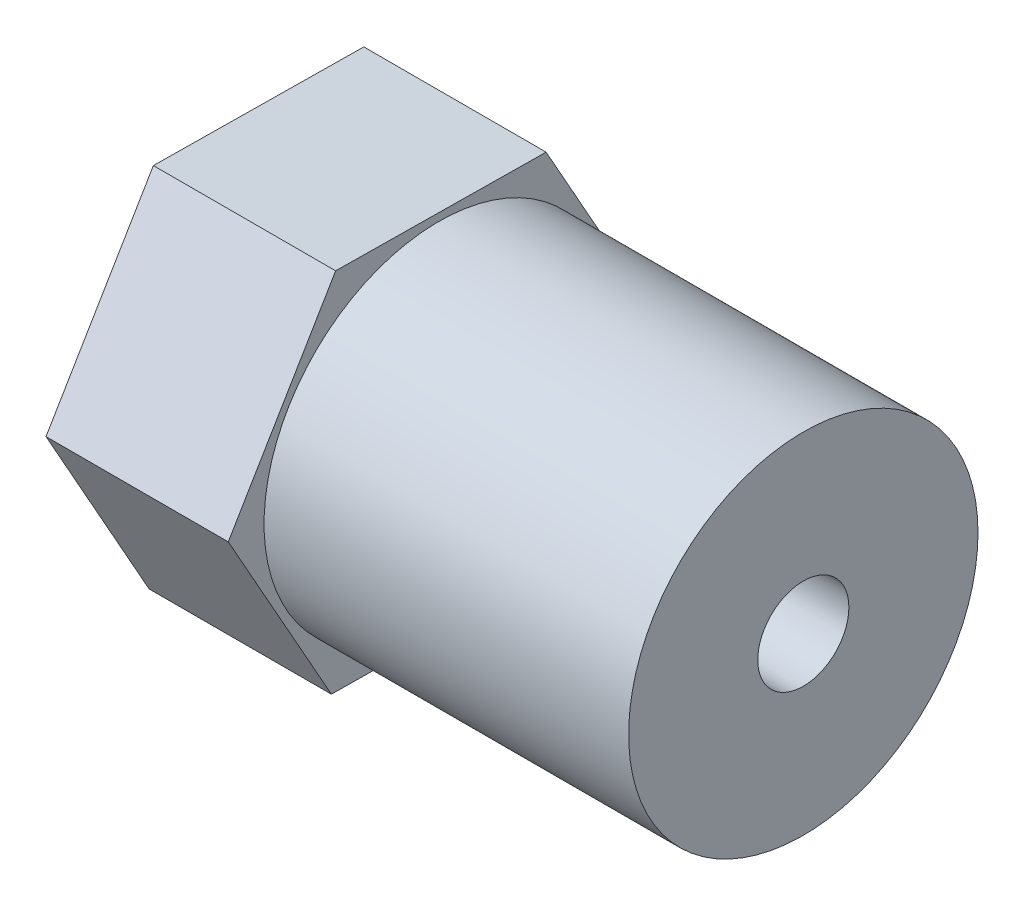
ISO-10303-21;
HEADER;
FILE_DESCRIPTION(('STEP AP214'),'2;1');
FILE_NAME('part.step','',(''),(''),'','','');
FILE_SCHEMA(('AUTOMOTIVE_DESIGN { 1 0 10303 214 1 1 1 1 }'));
ENDSEC;
DATA;
#1=APPLICATION_CONTEXT('core data for automotive mechanical design processes');
#2=APPLICATION_PROTOCOL_DEFINITION('international standard','automotive_design',2000,#1);
#3=PRODUCT_CONTEXT('',#1,'mechanical');
#4=PRODUCT('Part','Part','',(#3));
#5=PRODUCT_RELATED_PRODUCT_CATEGORY('part','',(#4));
#6=PRODUCT_DEFINITION_FORMATION('','',#4);
#7=PRODUCT_DEFINITION_CONTEXT('part definition',#1,'design');
#8=PRODUCT_DEFINITION('design','',#6,#7);
#9=PRODUCT_DEFINITION_SHAPE('','',#8);
#10=(LENGTH_UNIT() NAMED_UNIT(*) SI_UNIT(.MILLI.,.METRE.));
#11=(NAMED_UNIT(*) PLANE_ANGLE_UNIT() SI_UNIT($,.RADIAN.));
#12=(NAMED_UNIT(*) SI_UNIT($,.STERADIAN.) SOLID_ANGLE_UNIT());
#13=UNCERTAINTY_MEASURE_WITH_UNIT(LENGTH_MEASURE(1.E-05),#10,'distance_accuracy_value','');
#14=(GEOMETRIC_REPRESENTATION_CONTEXT(3) GLOBAL_UNCERTAINTY_ASSIGNED_CONTEXT((#13)) GLOBAL_UNIT_ASSIGNED_CONTEXT((#10,
#11,#12)) REPRESENTATION_CONTEXT('',''));
#15=CARTESIAN_POINT('',(0.,0.,0.));
#16=DIRECTION('',(0.,0.,1.));
#17=DIRECTION('',(1.,0.,0.));
#18=AXIS2_PLACEMENT_3D('',#15,#16,#17);
#19=CARTESIAN_POINT('',(6.,-5.95919597660058,3.53383408106089));
#20=DIRECTION('',(0.,0.99993200432157,-0.0116613349771016));
#21=DIRECTION('',(0.,0.0116613349771016,0.99993200432157));
#22=AXIS2_PLACEMENT_3D('',#19,#20,#21);
#23=PLANE('',#22);
#24=DIRECTION('',(0.,-0.0116613349771016,-0.99993200432157));
#25=VECTOR('',#24,1.);
#26=CARTESIAN_POINT('',(0.,-5.95919597660058,3.53383408106089));
#27=LINE('',#26,#25);
#28=CARTESIAN_POINT('',(0.,-5.95919597660058,3.53383408106089));
#29=VERTEX_POINT('',#28);
#30=CARTESIAN_POINT('',(0.,-6.03998807525826,-3.39389806133567));
#31=VERTEX_POINT('',#30);
#32=EDGE_CURVE('E121',#29,#31,#27,.T.);
#33=ORIENTED_EDGE('',*,*,#32,.T.);
#34=DIRECTION('',(-1.,0.,0.));
#35=VECTOR('',#34,1.);
#36=CARTESIAN_POINT('',(6.,-6.03998807525826,-3.39389806133567));
#37=LINE('',#36,#35);
#38=CARTESIAN_POINT('',(6.,-6.03998807525826,-3.39389806133567));
#39=VERTEX_POINT('',#38);
#40=EDGE_CURVE('E38',#39,#31,#37,.T.);
#41=ORIENTED_EDGE('',*,*,#40,.F.);
#42=DIRECTION('',(0.,-0.0116613349771016,-0.99993200432157));
#43=VECTOR('',#42,1.);
#44=CARTESIAN_POINT('',(6.,-5.95919597660058,3.53383408106089));
#45=LINE('',#44,#43);
#46=CARTESIAN_POINT('',(6.,-5.95919597660058,3.53383408106089));
#47=VERTEX_POINT('',#46);
#48=EDGE_CURVE('E132',#47,#39,#45,.T.);
#49=ORIENTED_EDGE('',*,*,#48,.F.);
#50=DIRECTION('',(-1.,0.,0.));
#51=VECTOR('',#50,1.);
#52=CARTESIAN_POINT('',(6.,-5.95919597660058,3.53383408106089));
#53=LINE('',#52,#51);
#54=EDGE_CURVE('E117',#47,#29,#53,.T.);
#55=ORIENTED_EDGE('',*,*,#54,.T.);
#56=EDGE_LOOP('',(#33,#41,#49,#55));
#57=FACE_BOUND('',#56,.T.);
#58=ADVANCED_FACE('F35',(#57),#23,.F.);
#59=CARTESIAN_POINT('',(6.,-6.03998807525826,-3.39389806133567));
#60=DIRECTION('',(0.,0.510065014492994,0.86013585031102));
#61=DIRECTION('',(0.,-0.86013585031102,0.510065014492995));
#62=AXIS2_PLACEMENT_3D('',#59,#60,#61);
#63=PLANE('',#62);
#64=DIRECTION('',(0.,0.86013585031102,-0.510065014492994));
#65=VECTOR('',#64,1.);
#66=CARTESIAN_POINT('',(0.,-6.03998807525826,-3.39389806133567));
#67=LINE('',#66,#65);
#68=CARTESIAN_POINT('',(0.,-0.0807920986576771,-6.92773214239656));
#69=VERTEX_POINT('',#68);
#70=EDGE_CURVE('E124',#31,#69,#67,.T.);
#71=ORIENTED_EDGE('',*,*,#70,.T.);
#72=DIRECTION('',(-1.,0.,0.));
#73=VECTOR('',#72,1.);
#74=CARTESIAN_POINT('',(6.,-0.0807920986576771,-6.92773214239656));
#75=LINE('',#74,#73);
#76=CARTESIAN_POINT('',(6.,-0.0807920986576771,-6.92773214239656));
#77=VERTEX_POINT('',#76);
#78=EDGE_CURVE('E135',#77,#69,#75,.T.);
#79=ORIENTED_EDGE('',*,*,#78,.F.);
#80=DIRECTION('',(0.,0.86013585031102,-0.510065014492994));
#81=VECTOR('',#80,1.);
#82=CARTESIAN_POINT('',(6.,-6.03998807525826,-3.39389806133567));
#83=LINE('',#82,#81);
#84=EDGE_CURVE('E90',#39,#77,#83,.T.);
#85=ORIENTED_EDGE('',*,*,#84,.F.);
#86=ORIENTED_EDGE('',*,*,#40,.T.);
#87=EDGE_LOOP('',(#71,#79,#85,#86));
#88=FACE_BOUND('',#87,.T.);
#89=ADVANCED_FACE('F140',(#88),#63,.F.);
#90=CARTESIAN_POINT('',(6.,-0.0807920986576771,-6.92773214239656));
#91=DIRECTION('',(0.,-0.489866989828575,0.871797185288121));
#92=DIRECTION('',(0.,-0.871797185288121,-0.489866989828575));
#93=AXIS2_PLACEMENT_3D('',#90,#91,#92);
#94=PLANE('',#93);
#95=DIRECTION('',(0.,0.871797185288121,0.489866989828575));
#96=VECTOR('',#95,1.);
#97=CARTESIAN_POINT('',(0.,-0.0807920986576771,-6.92773214239656));
#98=LINE('',#97,#96);
#99=CARTESIAN_POINT('',(0.,5.95919597660058,-3.53383408106088));
#100=VERTEX_POINT('',#99);
#101=EDGE_CURVE('E127',#69,#100,#98,.T.);
#102=ORIENTED_EDGE('',*,*,#101,.T.);
#103=DIRECTION('',(-1.,0.,0.));
#104=VECTOR('',#103,1.);
#105=CARTESIAN_POINT('',(6.,5.95919597660058,-3.53383408106088));
#106=LINE('',#105,#104);
#107=CARTESIAN_POINT('',(6.,5.95919597660058,-3.53383408106088));
#108=VERTEX_POINT('',#107);
#109=EDGE_CURVE('E112',#108,#100,#106,.T.);
#110=ORIENTED_EDGE('',*,*,#109,.F.);
#111=DIRECTION('',(0.,0.871797185288121,0.489866989828575));
#112=VECTOR('',#111,1.);
#113=CARTESIAN_POINT('',(6.,-0.0807920986576771,-6.92773214239656));
#114=LINE('',#113,#112);
#115=EDGE_CURVE('E103',#77,#108,#114,.T.);
#116=ORIENTED_EDGE('',*,*,#115,.F.);
#117=ORIENTED_EDGE('',*,*,#78,.T.);
#118=EDGE_LOOP('',(#102,#110,#116,#117));
#119=FACE_BOUND('',#118,.T.);
#120=ADVANCED_FACE('F146',(#119),#94,.F.);
#121=CARTESIAN_POINT('',(6.,5.95919597660058,-3.53383408106088));
#122=DIRECTION('',(0.,-0.99993200432157,0.0116613349771014));
#123=DIRECTION('',(0.,-0.0116613349771014,-0.99993200432157));
#124=AXIS2_PLACEMENT_3D('',#121,#122,#123);
#125=PLANE('',#124);
#126=DIRECTION('',(0.,0.0116613349771014,0.99993200432157));
#127=VECTOR('',#126,1.);
#128=CARTESIAN_POINT('',(0.,5.95919597660058,-3.53383408106088));
#129=LINE('',#128,#127);
#130=CARTESIAN_POINT('',(0.,6.03998807525826,3.39389806133567));
#131=VERTEX_POINT('',#130);
#132=EDGE_CURVE('E111',#100,#131,#129,.T.);
#133=ORIENTED_EDGE('',*,*,#132,.T.);
#134=DIRECTION('',(-1.,0.,0.));
#135=VECTOR('',#134,1.);
#136=CARTESIAN_POINT('',(6.,6.03998807525826,3.39389806133567));
#137=LINE('',#136,#135);
#138=CARTESIAN_POINT('',(6.,6.03998807525826,3.39389806133567));
#139=VERTEX_POINT('',#138);
#140=EDGE_CURVE('E108',#139,#131,#137,.T.);
#141=ORIENTED_EDGE('',*,*,#140,.F.);
#142=DIRECTION('',(0.,0.0116613349771014,0.99993200432157));
#143=VECTOR('',#142,1.);
#144=CARTESIAN_POINT('',(6.,5.95919597660058,-3.53383408106088));
#145=LINE('',#144,#143);
#146=EDGE_CURVE('E97',#108,#139,#145,.T.);
#147=ORIENTED_EDGE('',*,*,#146,.F.);
#148=ORIENTED_EDGE('',*,*,#109,.T.);
#149=EDGE_LOOP('',(#133,#141,#147,#148));
#150=FACE_BOUND('',#149,.T.);
#151=ADVANCED_FACE('F109',(#150),#125,.F.);
#152=CARTESIAN_POINT('',(6.,6.03998807525826,3.39389806133567));
#153=DIRECTION('',(0.,-0.510065014492995,-0.86013585031102));
#154=DIRECTION('',(0.,0.86013585031102,-0.510065014492995));
#155=AXIS2_PLACEMENT_3D('',#152,#153,#154);
#156=PLANE('',#155);
#157=DIRECTION('',(0.,-0.86013585031102,0.510065014492995));
#158=VECTOR('',#157,1.);
#159=CARTESIAN_POINT('',(0.,6.03998807525826,3.39389806133567));
#160=LINE('',#159,#158);
#161=CARTESIAN_POINT('',(0.,0.0807920986576778,6.92773214239656));
#162=VERTEX_POINT('',#161);
#163=EDGE_CURVE('E75',#131,#162,#160,.T.);
#164=ORIENTED_EDGE('',*,*,#163,.T.);
#165=DIRECTION('',(-1.,0.,0.));
#166=VECTOR('',#165,1.);
#167=CARTESIAN_POINT('',(6.,0.0807920986576778,6.92773214239656));
#168=LINE('',#167,#166);
#169=CARTESIAN_POINT('',(6.,0.0807920986576778,6.92773214239656));
#170=VERTEX_POINT('',#169);
#171=EDGE_CURVE('E113',#170,#162,#168,.T.);
#172=ORIENTED_EDGE('',*,*,#171,.F.);
#173=DIRECTION('',(0.,-0.86013585031102,0.510065014492995));
#174=VECTOR('',#173,1.);
#175=CARTESIAN_POINT('',(6.,6.03998807525826,3.39389806133567));
#176=LINE('',#175,#174);
#177=EDGE_CURVE('E101',#139,#170,#176,.T.);
#178=ORIENTED_EDGE('',*,*,#177,.F.);
#179=ORIENTED_EDGE('',*,*,#140,.T.);
#180=EDGE_LOOP('',(#164,#172,#178,#179));
#181=FACE_BOUND('',#180,.T.);
#182=ADVANCED_FACE('F115',(#181),#156,.F.);
#183=CARTESIAN_POINT('',(6.,0.0807920986576778,6.92773214239656));
#184=DIRECTION('',(0.,0.489866989828575,-0.871797185288121));
#185=DIRECTION('',(0.,0.871797185288121,0.489866989828575));
#186=AXIS2_PLACEMENT_3D('',#183,#184,#185);
#187=PLANE('',#186);
#188=DIRECTION('',(0.,-0.871797185288121,-0.489866989828575));
#189=VECTOR('',#188,1.);
#190=CARTESIAN_POINT('',(0.,0.0807920986576778,6.92773214239656));
#191=LINE('',#190,#189);
#192=EDGE_CURVE('E81',#162,#29,#191,.T.);
#193=ORIENTED_EDGE('',*,*,#192,.T.);
#194=ORIENTED_EDGE('',*,*,#54,.F.);
#195=DIRECTION('',(0.,-0.871797185288121,-0.489866989828575));
#196=VECTOR('',#195,1.);
#197=CARTESIAN_POINT('',(6.,0.0807920986576778,6.92773214239656));
#198=LINE('',#197,#196);
#199=EDGE_CURVE('E52',#170,#47,#198,.T.);
#200=ORIENTED_EDGE('',*,*,#199,.F.);
#201=ORIENTED_EDGE('',*,*,#171,.T.);
#202=EDGE_LOOP('',(#193,#194,#200,#201));
#203=FACE_BOUND('',#202,.T.);
#204=ADVANCED_FACE('F197',(#203),#187,.F.);
#205=CARTESIAN_POINT('',(6.,0.,0.));
#206=DIRECTION('',(1.,0.,0.));
#207=DIRECTION('',(0.,0.,-1.));
#208=AXIS2_PLACEMENT_3D('',#205,#206,#207);
#209=PLANE('',#208);
#210=CARTESIAN_POINT('',(6.,0.,0.));
#211=DIRECTION('',(1.,0.,0.));
#212=DIRECTION('',(0.,0.,-1.));
#213=AXIS2_PLACEMENT_3D('',#210,#211,#212);
#214=CIRCLE('',#213,5.75);
#215=CARTESIAN_POINT('',(6.,0.,-5.75));
#216=VERTEX_POINT('',#215);
#217=EDGE_CURVE('E11',#216,#216,#214,.T.);
#218=ORIENTED_EDGE('',*,*,#217,.F.);
#219=EDGE_LOOP('',(#218));
#220=FACE_BOUND('',#219,.T.);
#221=ORIENTED_EDGE('',*,*,#48,.T.);
#222=ORIENTED_EDGE('',*,*,#84,.T.);
#223=ORIENTED_EDGE('',*,*,#115,.T.);
#224=ORIENTED_EDGE('',*,*,#146,.T.);
#225=ORIENTED_EDGE('',*,*,#177,.T.);
#226=ORIENTED_EDGE('',*,*,#199,.T.);
#227=EDGE_LOOP('',(#221,#222,#223,#224,#225,#226));
#228=FACE_BOUND('',#227,.T.);
#229=ADVANCED_FACE('F99',(#220,#228),#209,.T.);
#230=CARTESIAN_POINT('',(0.,0.,0.));
#231=DIRECTION('',(1.,0.,0.));
#232=DIRECTION('',(0.,0.,-1.));
#233=AXIS2_PLACEMENT_3D('',#230,#231,#232);
#234=PLANE('',#233);
#235=CARTESIAN_POINT('',(0.,0.,0.));
#236=DIRECTION('',(1.,0.,0.));
#237=DIRECTION('',(0.,0.,-1.));
#238=AXIS2_PLACEMENT_3D('',#235,#236,#237);
#239=CIRCLE('',#238,2.);
#240=CARTESIAN_POINT('',(0.,0.,-2.));
#241=VERTEX_POINT('',#240);
#242=EDGE_CURVE('E125',#241,#241,#239,.T.);
#243=ORIENTED_EDGE('',*,*,#242,.T.);
#244=EDGE_LOOP('',(#243));
#245=FACE_BOUND('',#244,.T.);
#246=ORIENTED_EDGE('',*,*,#32,.F.);
#247=ORIENTED_EDGE('',*,*,#192,.F.);
#248=ORIENTED_EDGE('',*,*,#163,.F.);
#249=ORIENTED_EDGE('',*,*,#132,.F.);
#250=ORIENTED_EDGE('',*,*,#101,.F.);
#251=ORIENTED_EDGE('',*,*,#70,.F.);
#252=EDGE_LOOP('',(#246,#247,#248,#249,#250,#251));
#253=FACE_BOUND('',#252,.T.);
#254=ADVANCED_FACE('F145',(#245,#253),#234,.F.);
#255=CARTESIAN_POINT('',(0.,0.,0.));
#256=DIRECTION('',(1.,0.,0.));
#257=DIRECTION('',(0.,0.,-1.));
#258=AXIS2_PLACEMENT_3D('',#255,#256,#257);
#259=CYLINDRICAL_SURFACE('',#258,2.);
#260=ORIENTED_EDGE('',*,*,#242,.F.);
#261=EDGE_LOOP('',(#260));
#262=FACE_BOUND('',#261,.T.);
#263=CARTESIAN_POINT('',(6.,0.,0.));
#264=DIRECTION('',(1.,0.,0.));
#265=DIRECTION('',(0.,0.,-1.));
#266=AXIS2_PLACEMENT_3D('',#263,#264,#265);
#267=CIRCLE('',#266,2.);
#268=CARTESIAN_POINT('',(6.,0.,-2.));
#269=VERTEX_POINT('',#268);
#270=EDGE_CURVE('E150',#269,#269,#267,.T.);
#271=ORIENTED_EDGE('',*,*,#270,.T.);
#272=EDGE_LOOP('',(#271));
#273=FACE_BOUND('',#272,.T.);
#274=ADVANCED_FACE('F171',(#262,#273),#259,.F.);
#275=CARTESIAN_POINT('',(18.,0.,0.));
#276=DIRECTION('',(1.,0.,0.));
#277=DIRECTION('',(0.,0.,-1.));
#278=AXIS2_PLACEMENT_3D('',#275,#276,#277);
#279=PLANE('',#278);
#280=CARTESIAN_POINT('',(18.,0.,0.));
#281=DIRECTION('',(1.,0.,0.));
#282=DIRECTION('',(0.,0.,-1.));
#283=AXIS2_PLACEMENT_3D('',#280,#281,#282);
#284=CIRCLE('',#283,5.75);
#285=CARTESIAN_POINT('',(18.,0.,-5.75));
#286=VERTEX_POINT('',#285);
#287=EDGE_CURVE('E153',#286,#286,#284,.T.);
#288=ORIENTED_EDGE('',*,*,#287,.T.);
#289=EDGE_LOOP('',(#288));
#290=FACE_BOUND('',#289,.T.);
#291=CARTESIAN_POINT('',(18.,0.,0.));
#292=DIRECTION('',(1.,0.,0.));
#293=DIRECTION('',(0.,0.,-1.));
#294=AXIS2_PLACEMENT_3D('',#291,#292,#293);
#295=CIRCLE('',#294,1.5);
#296=CARTESIAN_POINT('',(18.,0.,-1.5));
#297=VERTEX_POINT('',#296);
#298=EDGE_CURVE('E158',#297,#297,#295,.T.);
#299=ORIENTED_EDGE('',*,*,#298,.F.);
#300=EDGE_LOOP('',(#299));
#301=FACE_BOUND('',#300,.T.);
#302=ADVANCED_FACE('F168',(#290,#301),#279,.T.);
#303=CARTESIAN_POINT('',(6.,0.,0.));
#304=DIRECTION('',(1.,0.,0.));
#305=DIRECTION('',(0.,0.,-1.));
#306=AXIS2_PLACEMENT_3D('',#303,#304,#305);
#307=PLANE('',#306);
#308=ORIENTED_EDGE('',*,*,#270,.F.);
#309=EDGE_LOOP('',(#308));
#310=FACE_BOUND('',#309,.T.);
#311=CARTESIAN_POINT('',(6.,0.,0.));
#312=DIRECTION('',(1.,0.,0.));
#313=DIRECTION('',(0.,0.,-1.));
#314=AXIS2_PLACEMENT_3D('',#311,#312,#313);
#315=CIRCLE('',#314,1.5);
#316=CARTESIAN_POINT('',(6.,0.,-1.5));
#317=VERTEX_POINT('',#316);
#318=EDGE_CURVE('E159',#317,#317,#315,.T.);
#319=ORIENTED_EDGE('',*,*,#318,.T.);
#320=EDGE_LOOP('',(#319));
#321=FACE_BOUND('',#320,.T.);
#322=ADVANCED_FACE('F170',(#310,#321),#307,.F.);
#323=CARTESIAN_POINT('',(18.,0.,0.));
#324=DIRECTION('',(-1.,0.,0.));
#325=DIRECTION('',(0.,0.,1.));
#326=AXIS2_PLACEMENT_3D('',#323,#324,#325);
#327=CYLINDRICAL_SURFACE('',#326,5.75);
#328=ORIENTED_EDGE('',*,*,#287,.F.);
#329=EDGE_LOOP('',(#328));
#330=FACE_BOUND('',#329,.T.);
#331=ORIENTED_EDGE('',*,*,#217,.T.);
#332=EDGE_LOOP('',(#331));
#333=FACE_BOUND('',#332,.T.);
#334=ADVANCED_FACE('F178',(#330,#333),#327,.T.);
#335=CARTESIAN_POINT('',(18.,0.,0.));
#336=DIRECTION('',(-1.,0.,0.));
#337=DIRECTION('',(0.,0.,1.));
#338=AXIS2_PLACEMENT_3D('',#335,#336,#337);
#339=CYLINDRICAL_SURFACE('',#338,1.5);
#340=ORIENTED_EDGE('',*,*,#298,.T.);
#341=EDGE_LOOP('',(#340));
#342=FACE_BOUND('',#341,.T.);
#343=ORIENTED_EDGE('',*,*,#318,.F.);
#344=EDGE_LOOP('',(#343));
#345=FACE_BOUND('',#344,.T.);
#346=ADVANCED_FACE('F165',(#342,#345),#339,.F.);
#347=CLOSED_SHELL('',(#58,#89,#120,#151,#182,#204,#229,#254,#274,#302,#322,#334,#346));
#348=MANIFOLD_SOLID_BREP('B2',#347);
#349=ADVANCED_BREP_SHAPE_REPRESENTATION('',(#18,#348),#14);
#350=SHAPE_DEFINITION_REPRESENTATION(#9,#349);
ENDSEC;
END-ISO-10303-21;
